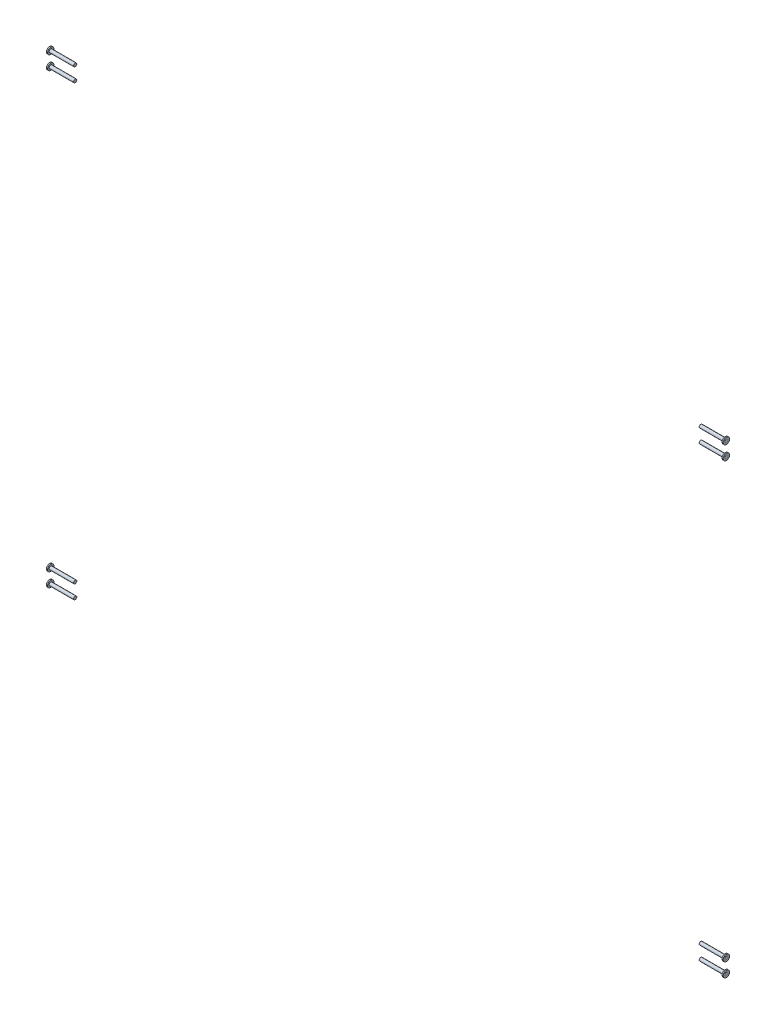
ISO-10303-21;
HEADER;
FILE_DESCRIPTION(('STEP AP214'),'2;1');
FILE_NAME('part.step','',(''),(''),'','','');
FILE_SCHEMA(('AUTOMOTIVE_DESIGN { 1 0 10303 214 1 1 1 1 }'));
ENDSEC;
DATA;
#1=APPLICATION_CONTEXT('core data for automotive mechanical design processes');
#2=APPLICATION_PROTOCOL_DEFINITION('international standard','automotive_design',2000,#1);
#3=PRODUCT_CONTEXT('',#1,'mechanical');
#4=PRODUCT('Part','Part','',(#3));
#5=PRODUCT_RELATED_PRODUCT_CATEGORY('part','',(#4));
#6=PRODUCT_DEFINITION_FORMATION('','',#4);
#7=PRODUCT_DEFINITION_CONTEXT('part definition',#1,'design');
#8=PRODUCT_DEFINITION('design','',#6,#7);
#9=PRODUCT_DEFINITION_SHAPE('','',#8);
#10=(LENGTH_UNIT() NAMED_UNIT(*) SI_UNIT(.MILLI.,.METRE.));
#11=(NAMED_UNIT(*) PLANE_ANGLE_UNIT() SI_UNIT($,.RADIAN.));
#12=(NAMED_UNIT(*) SI_UNIT($,.STERADIAN.) SOLID_ANGLE_UNIT());
#13=UNCERTAINTY_MEASURE_WITH_UNIT(LENGTH_MEASURE(1.E-05),#10,'distance_accuracy_value','');
#14=(GEOMETRIC_REPRESENTATION_CONTEXT(3) GLOBAL_UNCERTAINTY_ASSIGNED_CONTEXT((#13)) GLOBAL_UNIT_ASSIGNED_CONTEXT((#10,
#11,#12)) REPRESENTATION_CONTEXT('',''));
#15=CARTESIAN_POINT('',(0.,0.,0.));
#16=DIRECTION('',(0.,0.,1.));
#17=DIRECTION('',(1.,0.,0.));
#18=AXIS2_PLACEMENT_3D('',#15,#16,#17);
#19=CARTESIAN_POINT('',(-271.05,-200.,24.));
#20=DIRECTION('',(-1.,0.,0.));
#21=DIRECTION('',(0.,0.,1.));
#22=AXIS2_PLACEMENT_3D('',#19,#20,#21);
#23=CYLINDRICAL_SURFACE('',#22,1.4);
#24=CARTESIAN_POINT('',(-293.2,-200.,24.));
#25=DIRECTION('',(-1.,0.,0.));
#26=DIRECTION('',(0.,0.,1.));
#27=AXIS2_PLACEMENT_3D('',#24,#25,#26);
#28=CIRCLE('',#27,1.4);
#29=CARTESIAN_POINT('',(-293.2,-200.,25.4));
#30=VERTEX_POINT('',#29);
#31=EDGE_CURVE('P0_E10',#30,#30,#28,.F.);
#32=ORIENTED_EDGE('',*,*,#31,.F.);
#33=EDGE_LOOP('',(#32));
#34=FACE_BOUND('',#33,.T.);
#35=CARTESIAN_POINT('',(-293.3,-200.,24.));
#36=DIRECTION('',(1.,0.,0.));
#37=DIRECTION('',(0.,0.,-1.));
#38=AXIS2_PLACEMENT_3D('',#35,#36,#37);
#39=CIRCLE('',#38,1.4);
#40=CARTESIAN_POINT('',(-293.3,-200.,22.6));
#41=VERTEX_POINT('',#40);
#42=EDGE_CURVE('P0_E31',#41,#41,#39,.T.);
#43=ORIENTED_EDGE('',*,*,#42,.T.);
#44=EDGE_LOOP('',(#43));
#45=FACE_BOUND('',#44,.T.);
#46=ADVANCED_FACE('P0_F15',(#34,#45),#23,.T.);
#47=CARTESIAN_POINT('',(-293.3,-200.,24.));
#48=DIRECTION('',(-1.,0.,0.));
#49=DIRECTION('',(0.,0.,1.));
#50=AXIS2_PLACEMENT_3D('',#47,#48,#49);
#51=PLANE('',#50);
#52=ORIENTED_EDGE('',*,*,#42,.F.);
#53=EDGE_LOOP('',(#52));
#54=FACE_BOUND('',#53,.T.);
#55=ADVANCED_FACE('P0_F62',(#54),#51,.T.);
#56=CARTESIAN_POINT('',(-293.2,-200.,24.));
#57=DIRECTION('',(-1.,0.,0.));
#58=DIRECTION('',(0.,0.,1.));
#59=AXIS2_PLACEMENT_3D('',#56,#57,#58);
#60=PLANE('',#59);
#61=ORIENTED_EDGE('',*,*,#31,.T.);
#62=EDGE_LOOP('',(#61));
#63=FACE_BOUND('',#62,.T.);
#64=CARTESIAN_POINT('',(-293.2,-200.,24.));
#65=DIRECTION('',(1.,0.,0.));
#66=DIRECTION('',(0.,0.,-1.));
#67=AXIS2_PLACEMENT_3D('',#64,#65,#66);
#68=CIRCLE('',#67,2.75);
#69=CARTESIAN_POINT('',(-293.2,-200.,21.25));
#70=VERTEX_POINT('',#69);
#71=EDGE_CURVE('P0_E42',#70,#70,#68,.T.);
#72=ORIENTED_EDGE('',*,*,#71,.F.);
#73=EDGE_LOOP('',(#72));
#74=FACE_BOUND('',#73,.T.);
#75=ADVANCED_FACE('P0_F53',(#63,#74),#60,.T.);
#76=CARTESIAN_POINT('',(-292.2,-200.,24.));
#77=DIRECTION('',(1.,0.,0.));
#78=DIRECTION('',(0.,0.,-1.));
#79=AXIS2_PLACEMENT_3D('',#76,#77,#78);
#80=PLANE('',#79);
#81=CARTESIAN_POINT('',(-292.2,-200.,24.));
#82=DIRECTION('',(1.,0.,0.));
#83=DIRECTION('',(0.,0.,-1.));
#84=AXIS2_PLACEMENT_3D('',#81,#82,#83);
#85=CIRCLE('',#84,1.4);
#86=CARTESIAN_POINT('',(-292.2,-200.,22.6));
#87=VERTEX_POINT('',#86);
#88=EDGE_CURVE('P0_E23',#87,#87,#85,.F.);
#89=ORIENTED_EDGE('',*,*,#88,.T.);
#90=EDGE_LOOP('',(#89));
#91=FACE_BOUND('',#90,.T.);
#92=CARTESIAN_POINT('',(-292.2,-200.,24.));
#93=DIRECTION('',(-1.,0.,0.));
#94=DIRECTION('',(0.,0.,1.));
#95=AXIS2_PLACEMENT_3D('',#92,#93,#94);
#96=CIRCLE('',#95,2.75);
#97=CARTESIAN_POINT('',(-292.2,-200.,26.75));
#98=VERTEX_POINT('',#97);
#99=EDGE_CURVE('P0_E45',#98,#98,#96,.T.);
#100=ORIENTED_EDGE('',*,*,#99,.F.);
#101=EDGE_LOOP('',(#100));
#102=FACE_BOUND('',#101,.T.);
#103=ADVANCED_FACE('P0_F51',(#91,#102),#80,.T.);
#104=CARTESIAN_POINT('',(-292.2,-200.,24.));
#105=DIRECTION('',(-1.,0.,0.));
#106=DIRECTION('',(0.,0.,1.));
#107=AXIS2_PLACEMENT_3D('',#104,#105,#106);
#108=CYLINDRICAL_SURFACE('',#107,2.75);
#109=ORIENTED_EDGE('',*,*,#71,.T.);
#110=EDGE_LOOP('',(#109));
#111=FACE_BOUND('',#110,.T.);
#112=ORIENTED_EDGE('',*,*,#99,.T.);
#113=EDGE_LOOP('',(#112));
#114=FACE_BOUND('',#113,.T.);
#115=ADVANCED_FACE('P0_F49',(#111,#114),#108,.T.);
#116=CARTESIAN_POINT('',(-271.05,-200.,24.));
#117=DIRECTION('',(1.,0.,0.));
#118=DIRECTION('',(0.,0.,-1.));
#119=AXIS2_PLACEMENT_3D('',#116,#117,#118);
#120=PLANE('',#119);
#121=CARTESIAN_POINT('',(-271.05,-200.,24.));
#122=DIRECTION('',(-1.,0.,0.));
#123=DIRECTION('',(0.,0.,1.));
#124=AXIS2_PLACEMENT_3D('',#121,#122,#123);
#125=CIRCLE('',#124,1.4);
#126=CARTESIAN_POINT('',(-271.05,-200.,25.4));
#127=VERTEX_POINT('',#126);
#128=EDGE_CURVE('P0_E37',#127,#127,#125,.T.);
#129=ORIENTED_EDGE('',*,*,#128,.F.);
#130=EDGE_LOOP('',(#129));
#131=FACE_BOUND('',#130,.T.);
#132=ADVANCED_FACE('P0_F59',(#131),#120,.T.);
#133=ORIENTED_EDGE('',*,*,#88,.F.);
#134=EDGE_LOOP('',(#133));
#135=FACE_BOUND('',#134,.T.);
#136=ORIENTED_EDGE('',*,*,#128,.T.);
#137=EDGE_LOOP('',(#136));
#138=FACE_BOUND('',#137,.T.);
#139=ADVANCED_FACE('P0_F17',(#135,#138),#23,.T.);
#140=CLOSED_SHELL('',(#46,#55,#75,#103,#115,#132,#139));
#141=MANIFOLD_SOLID_BREP('P0_B1',#140);
#142=CARTESIAN_POINT('',(-271.05,-188.,24.));
#143=DIRECTION('',(-1.,0.,0.));
#144=DIRECTION('',(0.,0.,1.));
#145=AXIS2_PLACEMENT_3D('',#142,#143,#144);
#146=CYLINDRICAL_SURFACE('',#145,1.4);
#147=CARTESIAN_POINT('',(-293.2,-188.,24.));
#148=DIRECTION('',(-1.,0.,0.));
#149=DIRECTION('',(0.,0.,1.));
#150=AXIS2_PLACEMENT_3D('',#147,#148,#149);
#151=CIRCLE('',#150,1.4);
#152=CARTESIAN_POINT('',(-293.2,-188.,25.4));
#153=VERTEX_POINT('',#152);
#154=EDGE_CURVE('P1_E10',#153,#153,#151,.F.);
#155=ORIENTED_EDGE('',*,*,#154,.F.);
#156=EDGE_LOOP('',(#155));
#157=FACE_BOUND('',#156,.T.);
#158=CARTESIAN_POINT('',(-293.3,-188.,24.));
#159=DIRECTION('',(1.,0.,0.));
#160=DIRECTION('',(0.,0.,-1.));
#161=AXIS2_PLACEMENT_3D('',#158,#159,#160);
#162=CIRCLE('',#161,1.4);
#163=CARTESIAN_POINT('',(-293.3,-188.,22.6));
#164=VERTEX_POINT('',#163);
#165=EDGE_CURVE('P1_E29',#164,#164,#162,.T.);
#166=ORIENTED_EDGE('',*,*,#165,.T.);
#167=EDGE_LOOP('',(#166));
#168=FACE_BOUND('',#167,.T.);
#169=ADVANCED_FACE('P1_F15',(#157,#168),#146,.T.);
#170=CARTESIAN_POINT('',(-293.3,-188.,24.));
#171=DIRECTION('',(-1.,0.,0.));
#172=DIRECTION('',(0.,0.,1.));
#173=AXIS2_PLACEMENT_3D('',#170,#171,#172);
#174=PLANE('',#173);
#175=ORIENTED_EDGE('',*,*,#165,.F.);
#176=EDGE_LOOP('',(#175));
#177=FACE_BOUND('',#176,.T.);
#178=ADVANCED_FACE('P1_F62',(#177),#174,.T.);
#179=CARTESIAN_POINT('',(-293.2,-188.,24.));
#180=DIRECTION('',(-1.,0.,0.));
#181=DIRECTION('',(0.,0.,1.));
#182=AXIS2_PLACEMENT_3D('',#179,#180,#181);
#183=PLANE('',#182);
#184=ORIENTED_EDGE('',*,*,#154,.T.);
#185=EDGE_LOOP('',(#184));
#186=FACE_BOUND('',#185,.T.);
#187=CARTESIAN_POINT('',(-293.2,-188.,24.));
#188=DIRECTION('',(1.,0.,0.));
#189=DIRECTION('',(0.,0.,-1.));
#190=AXIS2_PLACEMENT_3D('',#187,#188,#189);
#191=CIRCLE('',#190,2.75);
#192=CARTESIAN_POINT('',(-293.2,-188.,21.25));
#193=VERTEX_POINT('',#192);
#194=EDGE_CURVE('P1_E40',#193,#193,#191,.T.);
#195=ORIENTED_EDGE('',*,*,#194,.F.);
#196=EDGE_LOOP('',(#195));
#197=FACE_BOUND('',#196,.T.);
#198=ADVANCED_FACE('P1_F53',(#186,#197),#183,.T.);
#199=CARTESIAN_POINT('',(-292.2,-188.,24.));
#200=DIRECTION('',(1.,0.,0.));
#201=DIRECTION('',(0.,0.,-1.));
#202=AXIS2_PLACEMENT_3D('',#199,#200,#201);
#203=PLANE('',#202);
#204=CARTESIAN_POINT('',(-292.2,-188.,24.));
#205=DIRECTION('',(1.,0.,0.));
#206=DIRECTION('',(0.,0.,-1.));
#207=AXIS2_PLACEMENT_3D('',#204,#205,#206);
#208=CIRCLE('',#207,1.4);
#209=CARTESIAN_POINT('',(-292.2,-188.,22.6));
#210=VERTEX_POINT('',#209);
#211=EDGE_CURVE('P1_E23',#210,#210,#208,.F.);
#212=ORIENTED_EDGE('',*,*,#211,.T.);
#213=EDGE_LOOP('',(#212));
#214=FACE_BOUND('',#213,.T.);
#215=CARTESIAN_POINT('',(-292.2,-188.,24.));
#216=DIRECTION('',(-1.,0.,0.));
#217=DIRECTION('',(0.,0.,1.));
#218=AXIS2_PLACEMENT_3D('',#215,#216,#217);
#219=CIRCLE('',#218,2.75);
#220=CARTESIAN_POINT('',(-292.2,-188.,26.75));
#221=VERTEX_POINT('',#220);
#222=EDGE_CURVE('P1_E44',#221,#221,#219,.T.);
#223=ORIENTED_EDGE('',*,*,#222,.F.);
#224=EDGE_LOOP('',(#223));
#225=FACE_BOUND('',#224,.T.);
#226=ADVANCED_FACE('P1_F51',(#214,#225),#203,.T.);
#227=CARTESIAN_POINT('',(-292.2,-188.,24.));
#228=DIRECTION('',(-1.,0.,0.));
#229=DIRECTION('',(0.,0.,1.));
#230=AXIS2_PLACEMENT_3D('',#227,#228,#229);
#231=CYLINDRICAL_SURFACE('',#230,2.75);
#232=ORIENTED_EDGE('',*,*,#194,.T.);
#233=EDGE_LOOP('',(#232));
#234=FACE_BOUND('',#233,.T.);
#235=ORIENTED_EDGE('',*,*,#222,.T.);
#236=EDGE_LOOP('',(#235));
#237=FACE_BOUND('',#236,.T.);
#238=ADVANCED_FACE('P1_F49',(#234,#237),#231,.T.);
#239=CARTESIAN_POINT('',(-271.05,-188.,24.));
#240=DIRECTION('',(1.,0.,0.));
#241=DIRECTION('',(0.,0.,-1.));
#242=AXIS2_PLACEMENT_3D('',#239,#240,#241);
#243=PLANE('',#242);
#244=CARTESIAN_POINT('',(-271.05,-188.,24.));
#245=DIRECTION('',(-1.,0.,0.));
#246=DIRECTION('',(0.,0.,1.));
#247=AXIS2_PLACEMENT_3D('',#244,#245,#246);
#248=CIRCLE('',#247,1.4);
#249=CARTESIAN_POINT('',(-271.05,-188.,25.4));
#250=VERTEX_POINT('',#249);
#251=EDGE_CURVE('P1_E34',#250,#250,#248,.T.);
#252=ORIENTED_EDGE('',*,*,#251,.F.);
#253=EDGE_LOOP('',(#252));
#254=FACE_BOUND('',#253,.T.);
#255=ADVANCED_FACE('P1_F59',(#254),#243,.T.);
#256=ORIENTED_EDGE('',*,*,#211,.F.);
#257=EDGE_LOOP('',(#256));
#258=FACE_BOUND('',#257,.T.);
#259=ORIENTED_EDGE('',*,*,#251,.T.);
#260=EDGE_LOOP('',(#259));
#261=FACE_BOUND('',#260,.T.);
#262=ADVANCED_FACE('P1_F17',(#258,#261),#146,.T.);
#263=CLOSED_SHELL('',(#169,#178,#198,#226,#238,#255,#262));
#264=MANIFOLD_SOLID_BREP('P1_B1',#263);
#265=CARTESIAN_POINT('',(-271.05,188.,24.));
#266=DIRECTION('',(-1.,0.,0.));
#267=DIRECTION('',(0.,0.,1.));
#268=AXIS2_PLACEMENT_3D('',#265,#266,#267);
#269=CYLINDRICAL_SURFACE('',#268,1.4);
#270=CARTESIAN_POINT('',(-293.2,188.,24.));
#271=DIRECTION('',(-1.,0.,0.));
#272=DIRECTION('',(0.,0.,1.));
#273=AXIS2_PLACEMENT_3D('',#270,#271,#272);
#274=CIRCLE('',#273,1.4);
#275=CARTESIAN_POINT('',(-293.2,188.,25.4));
#276=VERTEX_POINT('',#275);
#277=EDGE_CURVE('P2_E10',#276,#276,#274,.F.);
#278=ORIENTED_EDGE('',*,*,#277,.F.);
#279=EDGE_LOOP('',(#278));
#280=FACE_BOUND('',#279,.T.);
#281=CARTESIAN_POINT('',(-293.3,188.,24.));
#282=DIRECTION('',(1.,0.,0.));
#283=DIRECTION('',(0.,0.,-1.));
#284=AXIS2_PLACEMENT_3D('',#281,#282,#283);
#285=CIRCLE('',#284,1.4);
#286=CARTESIAN_POINT('',(-293.3,188.,22.6));
#287=VERTEX_POINT('',#286);
#288=EDGE_CURVE('P2_E31',#287,#287,#285,.T.);
#289=ORIENTED_EDGE('',*,*,#288,.T.);
#290=EDGE_LOOP('',(#289));
#291=FACE_BOUND('',#290,.T.);
#292=ADVANCED_FACE('P2_F15',(#280,#291),#269,.T.);
#293=CARTESIAN_POINT('',(-293.3,188.,24.));
#294=DIRECTION('',(-1.,0.,0.));
#295=DIRECTION('',(0.,0.,1.));
#296=AXIS2_PLACEMENT_3D('',#293,#294,#295);
#297=PLANE('',#296);
#298=ORIENTED_EDGE('',*,*,#288,.F.);
#299=EDGE_LOOP('',(#298));
#300=FACE_BOUND('',#299,.T.);
#301=ADVANCED_FACE('P2_F62',(#300),#297,.T.);
#302=CARTESIAN_POINT('',(-293.2,188.,24.));
#303=DIRECTION('',(-1.,0.,0.));
#304=DIRECTION('',(0.,0.,1.));
#305=AXIS2_PLACEMENT_3D('',#302,#303,#304);
#306=PLANE('',#305);
#307=ORIENTED_EDGE('',*,*,#277,.T.);
#308=EDGE_LOOP('',(#307));
#309=FACE_BOUND('',#308,.T.);
#310=CARTESIAN_POINT('',(-293.2,188.,24.));
#311=DIRECTION('',(1.,0.,0.));
#312=DIRECTION('',(0.,0.,-1.));
#313=AXIS2_PLACEMENT_3D('',#310,#311,#312);
#314=CIRCLE('',#313,2.75);
#315=CARTESIAN_POINT('',(-293.2,188.,21.25));
#316=VERTEX_POINT('',#315);
#317=EDGE_CURVE('P2_E42',#316,#316,#314,.T.);
#318=ORIENTED_EDGE('',*,*,#317,.F.);
#319=EDGE_LOOP('',(#318));
#320=FACE_BOUND('',#319,.T.);
#321=ADVANCED_FACE('P2_F53',(#309,#320),#306,.T.);
#322=CARTESIAN_POINT('',(-292.2,188.,24.));
#323=DIRECTION('',(1.,0.,0.));
#324=DIRECTION('',(0.,0.,-1.));
#325=AXIS2_PLACEMENT_3D('',#322,#323,#324);
#326=PLANE('',#325);
#327=CARTESIAN_POINT('',(-292.2,188.,24.));
#328=DIRECTION('',(1.,0.,0.));
#329=DIRECTION('',(0.,0.,-1.));
#330=AXIS2_PLACEMENT_3D('',#327,#328,#329);
#331=CIRCLE('',#330,1.4);
#332=CARTESIAN_POINT('',(-292.2,188.,22.6));
#333=VERTEX_POINT('',#332);
#334=EDGE_CURVE('P2_E23',#333,#333,#331,.F.);
#335=ORIENTED_EDGE('',*,*,#334,.T.);
#336=EDGE_LOOP('',(#335));
#337=FACE_BOUND('',#336,.T.);
#338=CARTESIAN_POINT('',(-292.2,188.,24.));
#339=DIRECTION('',(-1.,0.,0.));
#340=DIRECTION('',(0.,0.,1.));
#341=AXIS2_PLACEMENT_3D('',#338,#339,#340);
#342=CIRCLE('',#341,2.75);
#343=CARTESIAN_POINT('',(-292.2,188.,26.75));
#344=VERTEX_POINT('',#343);
#345=EDGE_CURVE('P2_E45',#344,#344,#342,.T.);
#346=ORIENTED_EDGE('',*,*,#345,.F.);
#347=EDGE_LOOP('',(#346));
#348=FACE_BOUND('',#347,.T.);
#349=ADVANCED_FACE('P2_F51',(#337,#348),#326,.T.);
#350=CARTESIAN_POINT('',(-292.2,188.,24.));
#351=DIRECTION('',(-1.,0.,0.));
#352=DIRECTION('',(0.,0.,1.));
#353=AXIS2_PLACEMENT_3D('',#350,#351,#352);
#354=CYLINDRICAL_SURFACE('',#353,2.75);
#355=ORIENTED_EDGE('',*,*,#317,.T.);
#356=EDGE_LOOP('',(#355));
#357=FACE_BOUND('',#356,.T.);
#358=ORIENTED_EDGE('',*,*,#345,.T.);
#359=EDGE_LOOP('',(#358));
#360=FACE_BOUND('',#359,.T.);
#361=ADVANCED_FACE('P2_F49',(#357,#360),#354,.T.);
#362=CARTESIAN_POINT('',(-271.05,188.,24.));
#363=DIRECTION('',(1.,0.,0.));
#364=DIRECTION('',(0.,0.,-1.));
#365=AXIS2_PLACEMENT_3D('',#362,#363,#364);
#366=PLANE('',#365);
#367=CARTESIAN_POINT('',(-271.05,188.,24.));
#368=DIRECTION('',(-1.,0.,0.));
#369=DIRECTION('',(0.,0.,1.));
#370=AXIS2_PLACEMENT_3D('',#367,#368,#369);
#371=CIRCLE('',#370,1.4);
#372=CARTESIAN_POINT('',(-271.05,188.,25.4));
#373=VERTEX_POINT('',#372);
#374=EDGE_CURVE('P2_E36',#373,#373,#371,.T.);
#375=ORIENTED_EDGE('',*,*,#374,.F.);
#376=EDGE_LOOP('',(#375));
#377=FACE_BOUND('',#376,.T.);
#378=ADVANCED_FACE('P2_F59',(#377),#366,.T.);
#379=ORIENTED_EDGE('',*,*,#334,.F.);
#380=EDGE_LOOP('',(#379));
#381=FACE_BOUND('',#380,.T.);
#382=ORIENTED_EDGE('',*,*,#374,.T.);
#383=EDGE_LOOP('',(#382));
#384=FACE_BOUND('',#383,.T.);
#385=ADVANCED_FACE('P2_F17',(#381,#384),#269,.T.);
#386=CLOSED_SHELL('',(#292,#301,#321,#349,#361,#378,#385));
#387=MANIFOLD_SOLID_BREP('P2_B1',#386);
#388=CARTESIAN_POINT('',(-271.05,200.,24.));
#389=DIRECTION('',(-1.,0.,0.));
#390=DIRECTION('',(0.,0.,1.));
#391=AXIS2_PLACEMENT_3D('',#388,#389,#390);
#392=CYLINDRICAL_SURFACE('',#391,1.4);
#393=CARTESIAN_POINT('',(-293.2,200.,24.));
#394=DIRECTION('',(-1.,0.,0.));
#395=DIRECTION('',(0.,0.,1.));
#396=AXIS2_PLACEMENT_3D('',#393,#394,#395);
#397=CIRCLE('',#396,1.4);
#398=CARTESIAN_POINT('',(-293.2,200.,25.4));
#399=VERTEX_POINT('',#398);
#400=EDGE_CURVE('P3_E10',#399,#399,#397,.F.);
#401=ORIENTED_EDGE('',*,*,#400,.F.);
#402=EDGE_LOOP('',(#401));
#403=FACE_BOUND('',#402,.T.);
#404=CARTESIAN_POINT('',(-293.3,200.,24.));
#405=DIRECTION('',(1.,0.,0.));
#406=DIRECTION('',(0.,0.,-1.));
#407=AXIS2_PLACEMENT_3D('',#404,#405,#406);
#408=CIRCLE('',#407,1.4);
#409=CARTESIAN_POINT('',(-293.3,200.,22.6));
#410=VERTEX_POINT('',#409);
#411=EDGE_CURVE('P3_E30',#410,#410,#408,.T.);
#412=ORIENTED_EDGE('',*,*,#411,.T.);
#413=EDGE_LOOP('',(#412));
#414=FACE_BOUND('',#413,.T.);
#415=ADVANCED_FACE('P3_F15',(#403,#414),#392,.T.);
#416=CARTESIAN_POINT('',(-293.3,200.,24.));
#417=DIRECTION('',(-1.,0.,0.));
#418=DIRECTION('',(0.,0.,1.));
#419=AXIS2_PLACEMENT_3D('',#416,#417,#418);
#420=PLANE('',#419);
#421=ORIENTED_EDGE('',*,*,#411,.F.);
#422=EDGE_LOOP('',(#421));
#423=FACE_BOUND('',#422,.T.);
#424=ADVANCED_FACE('P3_F62',(#423),#420,.T.);
#425=CARTESIAN_POINT('',(-293.2,200.,24.));
#426=DIRECTION('',(-1.,0.,0.));
#427=DIRECTION('',(0.,0.,1.));
#428=AXIS2_PLACEMENT_3D('',#425,#426,#427);
#429=PLANE('',#428);
#430=ORIENTED_EDGE('',*,*,#400,.T.);
#431=EDGE_LOOP('',(#430));
#432=FACE_BOUND('',#431,.T.);
#433=CARTESIAN_POINT('',(-293.2,200.,24.));
#434=DIRECTION('',(1.,0.,0.));
#435=DIRECTION('',(0.,0.,-1.));
#436=AXIS2_PLACEMENT_3D('',#433,#434,#435);
#437=CIRCLE('',#436,2.75);
#438=CARTESIAN_POINT('',(-293.2,200.,21.25));
#439=VERTEX_POINT('',#438);
#440=EDGE_CURVE('P3_E42',#439,#439,#437,.T.);
#441=ORIENTED_EDGE('',*,*,#440,.F.);
#442=EDGE_LOOP('',(#441));
#443=FACE_BOUND('',#442,.T.);
#444=ADVANCED_FACE('P3_F53',(#432,#443),#429,.T.);
#445=CARTESIAN_POINT('',(-292.2,200.,24.));
#446=DIRECTION('',(1.,0.,0.));
#447=DIRECTION('',(0.,0.,-1.));
#448=AXIS2_PLACEMENT_3D('',#445,#446,#447);
#449=PLANE('',#448);
#450=CARTESIAN_POINT('',(-292.2,200.,24.));
#451=DIRECTION('',(1.,0.,0.));
#452=DIRECTION('',(0.,0.,-1.));
#453=AXIS2_PLACEMENT_3D('',#450,#451,#452);
#454=CIRCLE('',#453,1.4);
#455=CARTESIAN_POINT('',(-292.2,200.,22.6));
#456=VERTEX_POINT('',#455);
#457=EDGE_CURVE('P3_E23',#456,#456,#454,.F.);
#458=ORIENTED_EDGE('',*,*,#457,.T.);
#459=EDGE_LOOP('',(#458));
#460=FACE_BOUND('',#459,.T.);
#461=CARTESIAN_POINT('',(-292.2,200.,24.));
#462=DIRECTION('',(-1.,0.,0.));
#463=DIRECTION('',(0.,0.,1.));
#464=AXIS2_PLACEMENT_3D('',#461,#462,#463);
#465=CIRCLE('',#464,2.75);
#466=CARTESIAN_POINT('',(-292.2,200.,26.75));
#467=VERTEX_POINT('',#466);
#468=EDGE_CURVE('P3_E45',#467,#467,#465,.T.);
#469=ORIENTED_EDGE('',*,*,#468,.F.);
#470=EDGE_LOOP('',(#469));
#471=FACE_BOUND('',#470,.T.);
#472=ADVANCED_FACE('P3_F51',(#460,#471),#449,.T.);
#473=CARTESIAN_POINT('',(-292.2,200.,24.));
#474=DIRECTION('',(-1.,0.,0.));
#475=DIRECTION('',(0.,0.,1.));
#476=AXIS2_PLACEMENT_3D('',#473,#474,#475);
#477=CYLINDRICAL_SURFACE('',#476,2.75);
#478=ORIENTED_EDGE('',*,*,#440,.T.);
#479=EDGE_LOOP('',(#478));
#480=FACE_BOUND('',#479,.T.);
#481=ORIENTED_EDGE('',*,*,#468,.T.);
#482=EDGE_LOOP('',(#481));
#483=FACE_BOUND('',#482,.T.);
#484=ADVANCED_FACE('P3_F49',(#480,#483),#477,.T.);
#485=CARTESIAN_POINT('',(-271.05,200.,24.));
#486=DIRECTION('',(1.,0.,0.));
#487=DIRECTION('',(0.,0.,-1.));
#488=AXIS2_PLACEMENT_3D('',#485,#486,#487);
#489=PLANE('',#488);
#490=CARTESIAN_POINT('',(-271.05,200.,24.));
#491=DIRECTION('',(-1.,0.,0.));
#492=DIRECTION('',(0.,0.,1.));
#493=AXIS2_PLACEMENT_3D('',#490,#491,#492);
#494=CIRCLE('',#493,1.4);
#495=CARTESIAN_POINT('',(-271.05,200.,25.4));
#496=VERTEX_POINT('',#495);
#497=EDGE_CURVE('P3_E36',#496,#496,#494,.T.);
#498=ORIENTED_EDGE('',*,*,#497,.F.);
#499=EDGE_LOOP('',(#498));
#500=FACE_BOUND('',#499,.T.);
#501=ADVANCED_FACE('P3_F59',(#500),#489,.T.);
#502=ORIENTED_EDGE('',*,*,#457,.F.);
#503=EDGE_LOOP('',(#502));
#504=FACE_BOUND('',#503,.T.);
#505=ORIENTED_EDGE('',*,*,#497,.T.);
#506=EDGE_LOOP('',(#505));
#507=FACE_BOUND('',#506,.T.);
#508=ADVANCED_FACE('P3_F17',(#504,#507),#392,.T.);
#509=CLOSED_SHELL('',(#415,#424,#444,#472,#484,#501,#508));
#510=MANIFOLD_SOLID_BREP('P3_B1',#509);
#511=CARTESIAN_POINT('',(271.05,-200.,24.));
#512=DIRECTION('',(1.,0.,0.));
#513=DIRECTION('',(0.,0.,-1.));
#514=AXIS2_PLACEMENT_3D('',#511,#512,#513);
#515=CYLINDRICAL_SURFACE('',#514,1.4);
#516=CARTESIAN_POINT('',(293.2,-200.,24.));
#517=DIRECTION('',(1.,0.,0.));
#518=DIRECTION('',(0.,0.,-1.));
#519=AXIS2_PLACEMENT_3D('',#516,#517,#518);
#520=CIRCLE('',#519,1.4);
#521=CARTESIAN_POINT('',(293.2,-200.,22.6));
#522=VERTEX_POINT('',#521);
#523=EDGE_CURVE('P4_E10',#522,#522,#520,.F.);
#524=ORIENTED_EDGE('',*,*,#523,.F.);
#525=EDGE_LOOP('',(#524));
#526=FACE_BOUND('',#525,.T.);
#527=CARTESIAN_POINT('',(293.3,-200.,24.));
#528=DIRECTION('',(-1.,0.,0.));
#529=DIRECTION('',(0.,0.,1.));
#530=AXIS2_PLACEMENT_3D('',#527,#528,#529);
#531=CIRCLE('',#530,1.4);
#532=CARTESIAN_POINT('',(293.3,-200.,25.4));
#533=VERTEX_POINT('',#532);
#534=EDGE_CURVE('P4_E30',#533,#533,#531,.T.);
#535=ORIENTED_EDGE('',*,*,#534,.T.);
#536=EDGE_LOOP('',(#535));
#537=FACE_BOUND('',#536,.T.);
#538=ADVANCED_FACE('P4_F15',(#526,#537),#515,.T.);
#539=CARTESIAN_POINT('',(293.3,-200.,24.));
#540=DIRECTION('',(1.,0.,0.));
#541=DIRECTION('',(0.,0.,-1.));
#542=AXIS2_PLACEMENT_3D('',#539,#540,#541);
#543=PLANE('',#542);
#544=ORIENTED_EDGE('',*,*,#534,.F.);
#545=EDGE_LOOP('',(#544));
#546=FACE_BOUND('',#545,.T.);
#547=ADVANCED_FACE('P4_F62',(#546),#543,.T.);
#548=CARTESIAN_POINT('',(293.2,-200.,24.));
#549=DIRECTION('',(1.,0.,0.));
#550=DIRECTION('',(0.,0.,-1.));
#551=AXIS2_PLACEMENT_3D('',#548,#549,#550);
#552=PLANE('',#551);
#553=ORIENTED_EDGE('',*,*,#523,.T.);
#554=EDGE_LOOP('',(#553));
#555=FACE_BOUND('',#554,.T.);
#556=CARTESIAN_POINT('',(293.2,-200.,24.));
#557=DIRECTION('',(-1.,0.,0.));
#558=DIRECTION('',(0.,0.,1.));
#559=AXIS2_PLACEMENT_3D('',#556,#557,#558);
#560=CIRCLE('',#559,2.75);
#561=CARTESIAN_POINT('',(293.2,-200.,26.75));
#562=VERTEX_POINT('',#561);
#563=EDGE_CURVE('P4_E41',#562,#562,#560,.T.);
#564=ORIENTED_EDGE('',*,*,#563,.F.);
#565=EDGE_LOOP('',(#564));
#566=FACE_BOUND('',#565,.T.);
#567=ADVANCED_FACE('P4_F53',(#555,#566),#552,.T.);
#568=CARTESIAN_POINT('',(292.2,-200.,24.));
#569=DIRECTION('',(-1.,0.,0.));
#570=DIRECTION('',(0.,0.,1.));
#571=AXIS2_PLACEMENT_3D('',#568,#569,#570);
#572=PLANE('',#571);
#573=CARTESIAN_POINT('',(292.2,-200.,24.));
#574=DIRECTION('',(-1.,0.,0.));
#575=DIRECTION('',(0.,0.,1.));
#576=AXIS2_PLACEMENT_3D('',#573,#574,#575);
#577=CIRCLE('',#576,1.4);
#578=CARTESIAN_POINT('',(292.2,-200.,25.4));
#579=VERTEX_POINT('',#578);
#580=EDGE_CURVE('P4_E23',#579,#579,#577,.F.);
#581=ORIENTED_EDGE('',*,*,#580,.T.);
#582=EDGE_LOOP('',(#581));
#583=FACE_BOUND('',#582,.T.);
#584=CARTESIAN_POINT('',(292.2,-200.,24.));
#585=DIRECTION('',(1.,0.,0.));
#586=DIRECTION('',(0.,0.,-1.));
#587=AXIS2_PLACEMENT_3D('',#584,#585,#586);
#588=CIRCLE('',#587,2.75);
#589=CARTESIAN_POINT('',(292.2,-200.,21.25));
#590=VERTEX_POINT('',#589);
#591=EDGE_CURVE('P4_E45',#590,#590,#588,.T.);
#592=ORIENTED_EDGE('',*,*,#591,.F.);
#593=EDGE_LOOP('',(#592));
#594=FACE_BOUND('',#593,.T.);
#595=ADVANCED_FACE('P4_F51',(#583,#594),#572,.T.);
#596=CARTESIAN_POINT('',(292.2,-200.,24.));
#597=DIRECTION('',(1.,0.,0.));
#598=DIRECTION('',(0.,0.,-1.));
#599=AXIS2_PLACEMENT_3D('',#596,#597,#598);
#600=CYLINDRICAL_SURFACE('',#599,2.75);
#601=ORIENTED_EDGE('',*,*,#563,.T.);
#602=EDGE_LOOP('',(#601));
#603=FACE_BOUND('',#602,.T.);
#604=ORIENTED_EDGE('',*,*,#591,.T.);
#605=EDGE_LOOP('',(#604));
#606=FACE_BOUND('',#605,.T.);
#607=ADVANCED_FACE('P4_F49',(#603,#606),#600,.T.);
#608=CARTESIAN_POINT('',(271.05,-200.,24.));
#609=DIRECTION('',(-1.,0.,0.));
#610=DIRECTION('',(0.,0.,1.));
#611=AXIS2_PLACEMENT_3D('',#608,#609,#610);
#612=PLANE('',#611);
#613=CARTESIAN_POINT('',(271.05,-200.,24.));
#614=DIRECTION('',(1.,0.,0.));
#615=DIRECTION('',(0.,0.,-1.));
#616=AXIS2_PLACEMENT_3D('',#613,#614,#615);
#617=CIRCLE('',#616,1.4);
#618=CARTESIAN_POINT('',(271.05,-200.,22.6));
#619=VERTEX_POINT('',#618);
#620=EDGE_CURVE('P4_E35',#619,#619,#617,.T.);
#621=ORIENTED_EDGE('',*,*,#620,.F.);
#622=EDGE_LOOP('',(#621));
#623=FACE_BOUND('',#622,.T.);
#624=ADVANCED_FACE('P4_F59',(#623),#612,.T.);
#625=ORIENTED_EDGE('',*,*,#580,.F.);
#626=EDGE_LOOP('',(#625));
#627=FACE_BOUND('',#626,.T.);
#628=ORIENTED_EDGE('',*,*,#620,.T.);
#629=EDGE_LOOP('',(#628));
#630=FACE_BOUND('',#629,.T.);
#631=ADVANCED_FACE('P4_F17',(#627,#630),#515,.T.);
#632=CLOSED_SHELL('',(#538,#547,#567,#595,#607,#624,#631));
#633=MANIFOLD_SOLID_BREP('P4_B1',#632);
#634=CARTESIAN_POINT('',(271.05,-188.,24.));
#635=DIRECTION('',(1.,0.,0.));
#636=DIRECTION('',(0.,0.,-1.));
#637=AXIS2_PLACEMENT_3D('',#634,#635,#636);
#638=CYLINDRICAL_SURFACE('',#637,1.4);
#639=CARTESIAN_POINT('',(293.2,-188.,24.));
#640=DIRECTION('',(1.,0.,0.));
#641=DIRECTION('',(0.,0.,-1.));
#642=AXIS2_PLACEMENT_3D('',#639,#640,#641);
#643=CIRCLE('',#642,1.4);
#644=CARTESIAN_POINT('',(293.2,-188.,22.6));
#645=VERTEX_POINT('',#644);
#646=EDGE_CURVE('P5_E10',#645,#645,#643,.F.);
#647=ORIENTED_EDGE('',*,*,#646,.F.);
#648=EDGE_LOOP('',(#647));
#649=FACE_BOUND('',#648,.T.);
#650=CARTESIAN_POINT('',(293.3,-188.,24.));
#651=DIRECTION('',(-1.,0.,0.));
#652=DIRECTION('',(0.,0.,1.));
#653=AXIS2_PLACEMENT_3D('',#650,#651,#652);
#654=CIRCLE('',#653,1.4);
#655=CARTESIAN_POINT('',(293.3,-188.,25.4));
#656=VERTEX_POINT('',#655);
#657=EDGE_CURVE('P5_E29',#656,#656,#654,.T.);
#658=ORIENTED_EDGE('',*,*,#657,.T.);
#659=EDGE_LOOP('',(#658));
#660=FACE_BOUND('',#659,.T.);
#661=ADVANCED_FACE('P5_F15',(#649,#660),#638,.T.);
#662=CARTESIAN_POINT('',(293.3,-188.,24.));
#663=DIRECTION('',(1.,0.,0.));
#664=DIRECTION('',(0.,0.,-1.));
#665=AXIS2_PLACEMENT_3D('',#662,#663,#664);
#666=PLANE('',#665);
#667=ORIENTED_EDGE('',*,*,#657,.F.);
#668=EDGE_LOOP('',(#667));
#669=FACE_BOUND('',#668,.T.);
#670=ADVANCED_FACE('P5_F62',(#669),#666,.T.);
#671=CARTESIAN_POINT('',(293.2,-188.,24.));
#672=DIRECTION('',(1.,0.,0.));
#673=DIRECTION('',(0.,0.,-1.));
#674=AXIS2_PLACEMENT_3D('',#671,#672,#673);
#675=PLANE('',#674);
#676=ORIENTED_EDGE('',*,*,#646,.T.);
#677=EDGE_LOOP('',(#676));
#678=FACE_BOUND('',#677,.T.);
#679=CARTESIAN_POINT('',(293.2,-188.,24.));
#680=DIRECTION('',(-1.,0.,0.));
#681=DIRECTION('',(0.,0.,1.));
#682=AXIS2_PLACEMENT_3D('',#679,#680,#681);
#683=CIRCLE('',#682,2.75);
#684=CARTESIAN_POINT('',(293.2,-188.,26.75));
#685=VERTEX_POINT('',#684);
#686=EDGE_CURVE('P5_E41',#685,#685,#683,.T.);
#687=ORIENTED_EDGE('',*,*,#686,.F.);
#688=EDGE_LOOP('',(#687));
#689=FACE_BOUND('',#688,.T.);
#690=ADVANCED_FACE('P5_F53',(#678,#689),#675,.T.);
#691=CARTESIAN_POINT('',(292.2,-188.,24.));
#692=DIRECTION('',(-1.,0.,0.));
#693=DIRECTION('',(0.,0.,1.));
#694=AXIS2_PLACEMENT_3D('',#691,#692,#693);
#695=PLANE('',#694);
#696=CARTESIAN_POINT('',(292.2,-188.,24.));
#697=DIRECTION('',(-1.,0.,0.));
#698=DIRECTION('',(0.,0.,1.));
#699=AXIS2_PLACEMENT_3D('',#696,#697,#698);
#700=CIRCLE('',#699,1.4);
#701=CARTESIAN_POINT('',(292.2,-188.,25.4));
#702=VERTEX_POINT('',#701);
#703=EDGE_CURVE('P5_E23',#702,#702,#700,.F.);
#704=ORIENTED_EDGE('',*,*,#703,.T.);
#705=EDGE_LOOP('',(#704));
#706=FACE_BOUND('',#705,.T.);
#707=CARTESIAN_POINT('',(292.2,-188.,24.));
#708=DIRECTION('',(1.,0.,0.));
#709=DIRECTION('',(0.,0.,-1.));
#710=AXIS2_PLACEMENT_3D('',#707,#708,#709);
#711=CIRCLE('',#710,2.75);
#712=CARTESIAN_POINT('',(292.2,-188.,21.25));
#713=VERTEX_POINT('',#712);
#714=EDGE_CURVE('P5_E44',#713,#713,#711,.T.);
#715=ORIENTED_EDGE('',*,*,#714,.F.);
#716=EDGE_LOOP('',(#715));
#717=FACE_BOUND('',#716,.T.);
#718=ADVANCED_FACE('P5_F51',(#706,#717),#695,.T.);
#719=CARTESIAN_POINT('',(292.2,-188.,24.));
#720=DIRECTION('',(1.,0.,0.));
#721=DIRECTION('',(0.,0.,-1.));
#722=AXIS2_PLACEMENT_3D('',#719,#720,#721);
#723=CYLINDRICAL_SURFACE('',#722,2.75);
#724=ORIENTED_EDGE('',*,*,#686,.T.);
#725=EDGE_LOOP('',(#724));
#726=FACE_BOUND('',#725,.T.);
#727=ORIENTED_EDGE('',*,*,#714,.T.);
#728=EDGE_LOOP('',(#727));
#729=FACE_BOUND('',#728,.T.);
#730=ADVANCED_FACE('P5_F49',(#726,#729),#723,.T.);
#731=CARTESIAN_POINT('',(271.05,-188.,24.));
#732=DIRECTION('',(-1.,0.,0.));
#733=DIRECTION('',(0.,0.,1.));
#734=AXIS2_PLACEMENT_3D('',#731,#732,#733);
#735=PLANE('',#734);
#736=CARTESIAN_POINT('',(271.05,-188.,24.));
#737=DIRECTION('',(1.,0.,0.));
#738=DIRECTION('',(0.,0.,-1.));
#739=AXIS2_PLACEMENT_3D('',#736,#737,#738);
#740=CIRCLE('',#739,1.4);
#741=CARTESIAN_POINT('',(271.05,-188.,22.6));
#742=VERTEX_POINT('',#741);
#743=EDGE_CURVE('P5_E35',#742,#742,#740,.T.);
#744=ORIENTED_EDGE('',*,*,#743,.F.);
#745=EDGE_LOOP('',(#744));
#746=FACE_BOUND('',#745,.T.);
#747=ADVANCED_FACE('P5_F59',(#746),#735,.T.);
#748=ORIENTED_EDGE('',*,*,#703,.F.);
#749=EDGE_LOOP('',(#748));
#750=FACE_BOUND('',#749,.T.);
#751=ORIENTED_EDGE('',*,*,#743,.T.);
#752=EDGE_LOOP('',(#751));
#753=FACE_BOUND('',#752,.T.);
#754=ADVANCED_FACE('P5_F17',(#750,#753),#638,.T.);
#755=CLOSED_SHELL('',(#661,#670,#690,#718,#730,#747,#754));
#756=MANIFOLD_SOLID_BREP('P5_B1',#755);
#757=CARTESIAN_POINT('',(271.05,188.,24.));
#758=DIRECTION('',(1.,0.,0.));
#759=DIRECTION('',(0.,0.,-1.));
#760=AXIS2_PLACEMENT_3D('',#757,#758,#759);
#761=CYLINDRICAL_SURFACE('',#760,1.4);
#762=CARTESIAN_POINT('',(293.2,188.,24.));
#763=DIRECTION('',(1.,0.,0.));
#764=DIRECTION('',(0.,0.,-1.));
#765=AXIS2_PLACEMENT_3D('',#762,#763,#764);
#766=CIRCLE('',#765,1.4);
#767=CARTESIAN_POINT('',(293.2,188.,22.6));
#768=VERTEX_POINT('',#767);
#769=EDGE_CURVE('P6_E10',#768,#768,#766,.F.);
#770=ORIENTED_EDGE('',*,*,#769,.F.);
#771=EDGE_LOOP('',(#770));
#772=FACE_BOUND('',#771,.T.);
#773=CARTESIAN_POINT('',(293.3,188.,24.));
#774=DIRECTION('',(-1.,0.,0.));
#775=DIRECTION('',(0.,0.,1.));
#776=AXIS2_PLACEMENT_3D('',#773,#774,#775);
#777=CIRCLE('',#776,1.4);
#778=CARTESIAN_POINT('',(293.3,188.,25.4));
#779=VERTEX_POINT('',#778);
#780=EDGE_CURVE('P6_E30',#779,#779,#777,.T.);
#781=ORIENTED_EDGE('',*,*,#780,.T.);
#782=EDGE_LOOP('',(#781));
#783=FACE_BOUND('',#782,.T.);
#784=ADVANCED_FACE('P6_F15',(#772,#783),#761,.T.);
#785=CARTESIAN_POINT('',(293.3,188.,24.));
#786=DIRECTION('',(1.,0.,0.));
#787=DIRECTION('',(0.,0.,-1.));
#788=AXIS2_PLACEMENT_3D('',#785,#786,#787);
#789=PLANE('',#788);
#790=ORIENTED_EDGE('',*,*,#780,.F.);
#791=EDGE_LOOP('',(#790));
#792=FACE_BOUND('',#791,.T.);
#793=ADVANCED_FACE('P6_F62',(#792),#789,.T.);
#794=CARTESIAN_POINT('',(293.2,188.,24.));
#795=DIRECTION('',(1.,0.,0.));
#796=DIRECTION('',(0.,0.,-1.));
#797=AXIS2_PLACEMENT_3D('',#794,#795,#796);
#798=PLANE('',#797);
#799=ORIENTED_EDGE('',*,*,#769,.T.);
#800=EDGE_LOOP('',(#799));
#801=FACE_BOUND('',#800,.T.);
#802=CARTESIAN_POINT('',(293.2,188.,24.));
#803=DIRECTION('',(-1.,0.,0.));
#804=DIRECTION('',(0.,0.,1.));
#805=AXIS2_PLACEMENT_3D('',#802,#803,#804);
#806=CIRCLE('',#805,2.75);
#807=CARTESIAN_POINT('',(293.2,188.,26.75));
#808=VERTEX_POINT('',#807);
#809=EDGE_CURVE('P6_E41',#808,#808,#806,.T.);
#810=ORIENTED_EDGE('',*,*,#809,.F.);
#811=EDGE_LOOP('',(#810));
#812=FACE_BOUND('',#811,.T.);
#813=ADVANCED_FACE('P6_F53',(#801,#812),#798,.T.);
#814=CARTESIAN_POINT('',(292.2,188.,24.));
#815=DIRECTION('',(-1.,0.,0.));
#816=DIRECTION('',(0.,0.,1.));
#817=AXIS2_PLACEMENT_3D('',#814,#815,#816);
#818=PLANE('',#817);
#819=CARTESIAN_POINT('',(292.2,188.,24.));
#820=DIRECTION('',(-1.,0.,0.));
#821=DIRECTION('',(0.,0.,1.));
#822=AXIS2_PLACEMENT_3D('',#819,#820,#821);
#823=CIRCLE('',#822,1.4);
#824=CARTESIAN_POINT('',(292.2,188.,25.4));
#825=VERTEX_POINT('',#824);
#826=EDGE_CURVE('P6_E23',#825,#825,#823,.F.);
#827=ORIENTED_EDGE('',*,*,#826,.T.);
#828=EDGE_LOOP('',(#827));
#829=FACE_BOUND('',#828,.T.);
#830=CARTESIAN_POINT('',(292.2,188.,24.));
#831=DIRECTION('',(1.,0.,0.));
#832=DIRECTION('',(0.,0.,-1.));
#833=AXIS2_PLACEMENT_3D('',#830,#831,#832);
#834=CIRCLE('',#833,2.75);
#835=CARTESIAN_POINT('',(292.2,188.,21.25));
#836=VERTEX_POINT('',#835);
#837=EDGE_CURVE('P6_E45',#836,#836,#834,.T.);
#838=ORIENTED_EDGE('',*,*,#837,.F.);
#839=EDGE_LOOP('',(#838));
#840=FACE_BOUND('',#839,.T.);
#841=ADVANCED_FACE('P6_F51',(#829,#840),#818,.T.);
#842=CARTESIAN_POINT('',(292.2,188.,24.));
#843=DIRECTION('',(1.,0.,0.));
#844=DIRECTION('',(0.,0.,-1.));
#845=AXIS2_PLACEMENT_3D('',#842,#843,#844);
#846=CYLINDRICAL_SURFACE('',#845,2.75);
#847=ORIENTED_EDGE('',*,*,#809,.T.);
#848=EDGE_LOOP('',(#847));
#849=FACE_BOUND('',#848,.T.);
#850=ORIENTED_EDGE('',*,*,#837,.T.);
#851=EDGE_LOOP('',(#850));
#852=FACE_BOUND('',#851,.T.);
#853=ADVANCED_FACE('P6_F49',(#849,#852),#846,.T.);
#854=CARTESIAN_POINT('',(271.05,188.,24.));
#855=DIRECTION('',(-1.,0.,0.));
#856=DIRECTION('',(0.,0.,1.));
#857=AXIS2_PLACEMENT_3D('',#854,#855,#856);
#858=PLANE('',#857);
#859=CARTESIAN_POINT('',(271.05,188.,24.));
#860=DIRECTION('',(1.,0.,0.));
#861=DIRECTION('',(0.,0.,-1.));
#862=AXIS2_PLACEMENT_3D('',#859,#860,#861);
#863=CIRCLE('',#862,1.4);
#864=CARTESIAN_POINT('',(271.05,188.,22.6));
#865=VERTEX_POINT('',#864);
#866=EDGE_CURVE('P6_E35',#865,#865,#863,.T.);
#867=ORIENTED_EDGE('',*,*,#866,.F.);
#868=EDGE_LOOP('',(#867));
#869=FACE_BOUND('',#868,.T.);
#870=ADVANCED_FACE('P6_F59',(#869),#858,.T.);
#871=ORIENTED_EDGE('',*,*,#826,.F.);
#872=EDGE_LOOP('',(#871));
#873=FACE_BOUND('',#872,.T.);
#874=ORIENTED_EDGE('',*,*,#866,.T.);
#875=EDGE_LOOP('',(#874));
#876=FACE_BOUND('',#875,.T.);
#877=ADVANCED_FACE('P6_F17',(#873,#876),#761,.T.);
#878=CLOSED_SHELL('',(#784,#793,#813,#841,#853,#870,#877));
#879=MANIFOLD_SOLID_BREP('P6_B1',#878);
#880=CARTESIAN_POINT('',(271.05,200.,24.));
#881=DIRECTION('',(1.,0.,0.));
#882=DIRECTION('',(0.,0.,-1.));
#883=AXIS2_PLACEMENT_3D('',#880,#881,#882);
#884=CYLINDRICAL_SURFACE('',#883,1.4);
#885=CARTESIAN_POINT('',(293.2,200.,24.));
#886=DIRECTION('',(1.,0.,0.));
#887=DIRECTION('',(0.,0.,-1.));
#888=AXIS2_PLACEMENT_3D('',#885,#886,#887);
#889=CIRCLE('',#888,1.4);
#890=CARTESIAN_POINT('',(293.2,200.,22.6));
#891=VERTEX_POINT('',#890);
#892=EDGE_CURVE('P7_E10',#891,#891,#889,.F.);
#893=ORIENTED_EDGE('',*,*,#892,.F.);
#894=EDGE_LOOP('',(#893));
#895=FACE_BOUND('',#894,.T.);
#896=CARTESIAN_POINT('',(293.3,200.,24.));
#897=DIRECTION('',(-1.,0.,0.));
#898=DIRECTION('',(0.,0.,1.));
#899=AXIS2_PLACEMENT_3D('',#896,#897,#898);
#900=CIRCLE('',#899,1.4);
#901=CARTESIAN_POINT('',(293.3,200.,25.4));
#902=VERTEX_POINT('',#901);
#903=EDGE_CURVE('P7_E31',#902,#902,#900,.T.);
#904=ORIENTED_EDGE('',*,*,#903,.T.);
#905=EDGE_LOOP('',(#904));
#906=FACE_BOUND('',#905,.T.);
#907=ADVANCED_FACE('P7_F15',(#895,#906),#884,.T.);
#908=CARTESIAN_POINT('',(293.3,200.,24.));
#909=DIRECTION('',(1.,0.,0.));
#910=DIRECTION('',(0.,0.,-1.));
#911=AXIS2_PLACEMENT_3D('',#908,#909,#910);
#912=PLANE('',#911);
#913=ORIENTED_EDGE('',*,*,#903,.F.);
#914=EDGE_LOOP('',(#913));
#915=FACE_BOUND('',#914,.T.);
#916=ADVANCED_FACE('P7_F62',(#915),#912,.T.);
#917=CARTESIAN_POINT('',(293.2,200.,24.));
#918=DIRECTION('',(1.,0.,0.));
#919=DIRECTION('',(0.,0.,-1.));
#920=AXIS2_PLACEMENT_3D('',#917,#918,#919);
#921=PLANE('',#920);
#922=ORIENTED_EDGE('',*,*,#892,.T.);
#923=EDGE_LOOP('',(#922));
#924=FACE_BOUND('',#923,.T.);
#925=CARTESIAN_POINT('',(293.2,200.,24.));
#926=DIRECTION('',(-1.,0.,0.));
#927=DIRECTION('',(0.,0.,1.));
#928=AXIS2_PLACEMENT_3D('',#925,#926,#927);
#929=CIRCLE('',#928,2.75);
#930=CARTESIAN_POINT('',(293.2,200.,26.75));
#931=VERTEX_POINT('',#930);
#932=EDGE_CURVE('P7_E41',#931,#931,#929,.T.);
#933=ORIENTED_EDGE('',*,*,#932,.F.);
#934=EDGE_LOOP('',(#933));
#935=FACE_BOUND('',#934,.T.);
#936=ADVANCED_FACE('P7_F53',(#924,#935),#921,.T.);
#937=CARTESIAN_POINT('',(292.2,200.,24.));
#938=DIRECTION('',(-1.,0.,0.));
#939=DIRECTION('',(0.,0.,1.));
#940=AXIS2_PLACEMENT_3D('',#937,#938,#939);
#941=PLANE('',#940);
#942=CARTESIAN_POINT('',(292.2,200.,24.));
#943=DIRECTION('',(-1.,0.,0.));
#944=DIRECTION('',(0.,0.,1.));
#945=AXIS2_PLACEMENT_3D('',#942,#943,#944);
#946=CIRCLE('',#945,1.4);
#947=CARTESIAN_POINT('',(292.2,200.,25.4));
#948=VERTEX_POINT('',#947);
#949=EDGE_CURVE('P7_E23',#948,#948,#946,.F.);
#950=ORIENTED_EDGE('',*,*,#949,.T.);
#951=EDGE_LOOP('',(#950));
#952=FACE_BOUND('',#951,.T.);
#953=CARTESIAN_POINT('',(292.2,200.,24.));
#954=DIRECTION('',(1.,0.,0.));
#955=DIRECTION('',(0.,0.,-1.));
#956=AXIS2_PLACEMENT_3D('',#953,#954,#955);
#957=CIRCLE('',#956,2.75);
#958=CARTESIAN_POINT('',(292.2,200.,21.25));
#959=VERTEX_POINT('',#958);
#960=EDGE_CURVE('P7_E44',#959,#959,#957,.T.);
#961=ORIENTED_EDGE('',*,*,#960,.F.);
#962=EDGE_LOOP('',(#961));
#963=FACE_BOUND('',#962,.T.);
#964=ADVANCED_FACE('P7_F51',(#952,#963),#941,.T.);
#965=CARTESIAN_POINT('',(292.2,200.,24.));
#966=DIRECTION('',(1.,0.,0.));
#967=DIRECTION('',(0.,0.,-1.));
#968=AXIS2_PLACEMENT_3D('',#965,#966,#967);
#969=CYLINDRICAL_SURFACE('',#968,2.75);
#970=ORIENTED_EDGE('',*,*,#932,.T.);
#971=EDGE_LOOP('',(#970));
#972=FACE_BOUND('',#971,.T.);
#973=ORIENTED_EDGE('',*,*,#960,.T.);
#974=EDGE_LOOP('',(#973));
#975=FACE_BOUND('',#974,.T.);
#976=ADVANCED_FACE('P7_F49',(#972,#975),#969,.T.);
#977=CARTESIAN_POINT('',(271.05,200.,24.));
#978=DIRECTION('',(-1.,0.,0.));
#979=DIRECTION('',(0.,0.,1.));
#980=AXIS2_PLACEMENT_3D('',#977,#978,#979);
#981=PLANE('',#980);
#982=CARTESIAN_POINT('',(271.05,200.,24.));
#983=DIRECTION('',(1.,0.,0.));
#984=DIRECTION('',(0.,0.,-1.));
#985=AXIS2_PLACEMENT_3D('',#982,#983,#984);
#986=CIRCLE('',#985,1.4);
#987=CARTESIAN_POINT('',(271.05,200.,22.6));
#988=VERTEX_POINT('',#987);
#989=EDGE_CURVE('P7_E36',#988,#988,#986,.T.);
#990=ORIENTED_EDGE('',*,*,#989,.F.);
#991=EDGE_LOOP('',(#990));
#992=FACE_BOUND('',#991,.T.);
#993=ADVANCED_FACE('P7_F59',(#992),#981,.T.);
#994=ORIENTED_EDGE('',*,*,#949,.F.);
#995=EDGE_LOOP('',(#994));
#996=FACE_BOUND('',#995,.T.);
#997=ORIENTED_EDGE('',*,*,#989,.T.);
#998=EDGE_LOOP('',(#997));
#999=FACE_BOUND('',#998,.T.);
#1000=ADVANCED_FACE('P7_F17',(#996,#999),#884,.T.);
#1001=CLOSED_SHELL('',(#907,#916,#936,#964,#976,#993,#1000));
#1002=MANIFOLD_SOLID_BREP('P7_B1',#1001);
#1003=ADVANCED_BREP_SHAPE_REPRESENTATION('',(#18,#141,#264,#387,#510,#633,#756,#879,#1002),#14);
#1004=SHAPE_DEFINITION_REPRESENTATION(#9,#1003);
ENDSEC;
END-ISO-10303-21;
